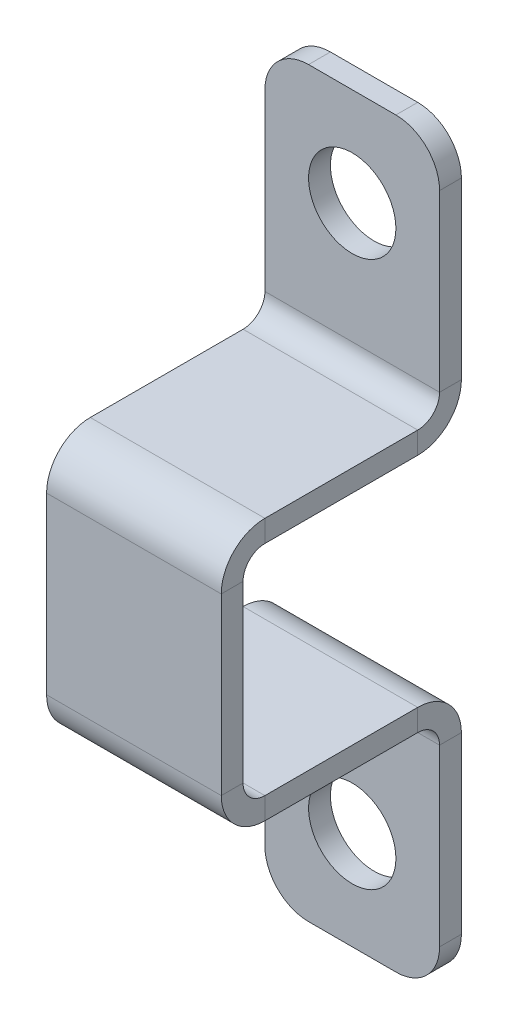
ISO-10303-21;
HEADER;
FILE_DESCRIPTION(('STEP AP214'),'2;1');
FILE_NAME('part.step','',(''),(''),'','','');
FILE_SCHEMA(('AUTOMOTIVE_DESIGN { 1 0 10303 214 1 1 1 1 }'));
ENDSEC;
DATA;
#1=APPLICATION_CONTEXT('core data for automotive mechanical design processes');
#2=APPLICATION_PROTOCOL_DEFINITION('international standard','automotive_design',2000,#1);
#3=PRODUCT_CONTEXT('',#1,'mechanical');
#4=PRODUCT('Part','Part','',(#3));
#5=PRODUCT_RELATED_PRODUCT_CATEGORY('part','',(#4));
#6=PRODUCT_DEFINITION_FORMATION('','',#4);
#7=PRODUCT_DEFINITION_CONTEXT('part definition',#1,'design');
#8=PRODUCT_DEFINITION('design','',#6,#7);
#9=PRODUCT_DEFINITION_SHAPE('','',#8);
#10=(LENGTH_UNIT() NAMED_UNIT(*) SI_UNIT(.MILLI.,.METRE.));
#11=(NAMED_UNIT(*) PLANE_ANGLE_UNIT() SI_UNIT($,.RADIAN.));
#12=(NAMED_UNIT(*) SI_UNIT($,.STERADIAN.) SOLID_ANGLE_UNIT());
#13=UNCERTAINTY_MEASURE_WITH_UNIT(LENGTH_MEASURE(1.E-05),#10,'distance_accuracy_value','');
#14=(GEOMETRIC_REPRESENTATION_CONTEXT(3) GLOBAL_UNCERTAINTY_ASSIGNED_CONTEXT((#13)) GLOBAL_UNIT_ASSIGNED_CONTEXT((#10,
#11,#12)) REPRESENTATION_CONTEXT('',''));
#15=CARTESIAN_POINT('',(0.,0.,0.));
#16=DIRECTION('',(0.,0.,1.));
#17=DIRECTION('',(1.,0.,0.));
#18=AXIS2_PLACEMENT_3D('',#15,#16,#17);
#19=CARTESIAN_POINT('',(58.047155018307,6.,14.0000000000001));
#20=DIRECTION('',(-1.,0.,0.));
#21=DIRECTION('',(0.,0.,1.));
#22=AXIS2_PLACEMENT_3D('',#19,#20,#21);
#23=PLANE('',#22);
#24=DIRECTION('',(0.,0.,-1.));
#25=VECTOR('',#24,1.);
#26=CARTESIAN_POINT('',(58.047155018307,6.,14.0000000000001));
#27=LINE('',#26,#25);
#28=CARTESIAN_POINT('',(58.047155018307,6.,13.0000000000001));
#29=VERTEX_POINT('',#28);
#30=CARTESIAN_POINT('',(58.047155018307,6.00000000000002,6.00000000000005));
#31=VERTEX_POINT('',#30);
#32=EDGE_CURVE('E314',#29,#31,#27,.T.);
#33=ORIENTED_EDGE('',*,*,#32,.T.);
#34=DIRECTION('',(0.,-1.,0.));
#35=VECTOR('',#34,1.);
#36=CARTESIAN_POINT('',(58.047155018307,6.00000000000002,6.00000000000005));
#37=LINE('',#36,#35);
#38=CARTESIAN_POINT('',(58.047155018307,5.00000000000002,6.00000000000005));
#39=VERTEX_POINT('',#38);
#40=EDGE_CURVE('E242',#31,#39,#37,.T.);
#41=ORIENTED_EDGE('',*,*,#40,.T.);
#42=DIRECTION('',(0.,0.,-1.));
#43=VECTOR('',#42,1.);
#44=CARTESIAN_POINT('',(58.047155018307,5.,14.0000000000001));
#45=LINE('',#44,#43);
#46=CARTESIAN_POINT('',(58.047155018307,5.,13.0000000000001));
#47=VERTEX_POINT('',#46);
#48=EDGE_CURVE('E313',#47,#39,#45,.T.);
#49=ORIENTED_EDGE('',*,*,#48,.F.);
#50=DIRECTION('',(0.,1.,0.));
#51=VECTOR('',#50,1.);
#52=CARTESIAN_POINT('',(58.047155018307,5.,13.0000000000001));
#53=LINE('',#52,#51);
#54=EDGE_CURVE('E301',#47,#29,#53,.T.);
#55=ORIENTED_EDGE('',*,*,#54,.T.);
#56=EDGE_LOOP('',(#33,#41,#49,#55));
#57=FACE_BOUND('',#56,.T.);
#58=ADVANCED_FACE('F36',(#57),#23,.T.);
#59=CARTESIAN_POINT('',(0.,6.00000000000005,0.));
#60=DIRECTION('',(0.,-1.,0.));
#61=DIRECTION('',(0.,0.,-1.));
#62=AXIS2_PLACEMENT_3D('',#59,#60,#61);
#63=PLANE('',#62);
#64=DIRECTION('',(-1.,0.,0.));
#65=VECTOR('',#64,1.);
#66=CARTESIAN_POINT('',(58.047155018307,6.00000000000002,6.00000000000005));
#67=LINE('',#66,#65);
#68=CARTESIAN_POINT('',(66.047155018307,6.00000000000002,6.00000000000005));
#69=VERTEX_POINT('',#68);
#70=EDGE_CURVE('E246',#31,#69,#67,.F.);
#71=ORIENTED_EDGE('',*,*,#70,.F.);
#72=ORIENTED_EDGE('',*,*,#32,.F.);
#73=DIRECTION('',(-1.,0.,0.));
#74=VECTOR('',#73,1.);
#75=CARTESIAN_POINT('',(0.,6.,13.0000000000001));
#76=LINE('',#75,#74);
#77=CARTESIAN_POINT('',(66.047155018307,6.,13.0000000000001));
#78=VERTEX_POINT('',#77);
#79=EDGE_CURVE('E309',#78,#29,#76,.T.);
#80=ORIENTED_EDGE('',*,*,#79,.F.);
#81=DIRECTION('',(0.,0.,1.));
#82=VECTOR('',#81,1.);
#83=CARTESIAN_POINT('',(66.047155018307,6.00000000000003,5.00000000000005));
#84=LINE('',#83,#82);
#85=EDGE_CURVE('E317',#69,#78,#84,.T.);
#86=ORIENTED_EDGE('',*,*,#85,.F.);
#87=EDGE_LOOP('',(#71,#72,#80,#86));
#88=FACE_BOUND('',#87,.T.);
#89=ADVANCED_FACE('F480',(#88),#63,.F.);
#90=CARTESIAN_POINT('',(0.,5.00000000000005,0.));
#91=DIRECTION('',(0.,-1.,0.));
#92=DIRECTION('',(0.,0.,-1.));
#93=AXIS2_PLACEMENT_3D('',#90,#91,#92);
#94=PLANE('',#93);
#95=ORIENTED_EDGE('',*,*,#48,.T.);
#96=DIRECTION('',(-1.,0.,0.));
#97=VECTOR('',#96,1.);
#98=CARTESIAN_POINT('',(58.047155018307,5.00000000000002,6.00000000000005));
#99=LINE('',#98,#97);
#100=CARTESIAN_POINT('',(66.047155018307,5.00000000000003,6.00000000000005));
#101=VERTEX_POINT('',#100);
#102=EDGE_CURVE('E206',#39,#101,#99,.F.);
#103=ORIENTED_EDGE('',*,*,#102,.T.);
#104=DIRECTION('',(0.,0.,1.));
#105=VECTOR('',#104,1.);
#106=CARTESIAN_POINT('',(66.047155018307,5.00000000000003,5.00000000000005));
#107=LINE('',#106,#105);
#108=CARTESIAN_POINT('',(66.047155018307,5.,13.0000000000001));
#109=VERTEX_POINT('',#108);
#110=EDGE_CURVE('E318',#101,#109,#107,.T.);
#111=ORIENTED_EDGE('',*,*,#110,.T.);
#112=DIRECTION('',(1.,0.,0.));
#113=VECTOR('',#112,1.);
#114=CARTESIAN_POINT('',(58.047155018307,5.,13.0000000000001));
#115=LINE('',#114,#113);
#116=EDGE_CURVE('E303',#47,#109,#115,.T.);
#117=ORIENTED_EDGE('',*,*,#116,.F.);
#118=EDGE_LOOP('',(#95,#103,#111,#117));
#119=FACE_BOUND('',#118,.T.);
#120=ADVANCED_FACE('F486',(#119),#94,.T.);
#121=CARTESIAN_POINT('',(66.047155018307,-6.00000000000003,5.00000000000005));
#122=DIRECTION('',(1.,0.,0.));
#123=DIRECTION('',(0.,0.,-1.));
#124=AXIS2_PLACEMENT_3D('',#121,#122,#123);
#125=PLANE('',#124);
#126=DIRECTION('',(0.,0.,-1.));
#127=VECTOR('',#126,1.);
#128=CARTESIAN_POINT('',(66.047155018307,-6.00000000000003,5.00000000000005));
#129=LINE('',#128,#127);
#130=CARTESIAN_POINT('',(66.047155018307,-6.,13.0000000000001));
#131=VERTEX_POINT('',#130);
#132=CARTESIAN_POINT('',(66.047155018307,-6.00000000000003,6.00000000000005));
#133=VERTEX_POINT('',#132);
#134=EDGE_CURVE('E359',#131,#133,#129,.T.);
#135=ORIENTED_EDGE('',*,*,#134,.T.);
#136=DIRECTION('',(0.,1.,0.));
#137=VECTOR('',#136,1.);
#138=CARTESIAN_POINT('',(66.047155018307,-6.00000000000003,6.00000000000005));
#139=LINE('',#138,#137);
#140=CARTESIAN_POINT('',(66.047155018307,-5.00000000000003,6.00000000000005));
#141=VERTEX_POINT('',#140);
#142=EDGE_CURVE('E287',#133,#141,#139,.T.);
#143=ORIENTED_EDGE('',*,*,#142,.T.);
#144=DIRECTION('',(0.,0.,-1.));
#145=VECTOR('',#144,1.);
#146=CARTESIAN_POINT('',(66.047155018307,-5.00000000000003,5.00000000000005));
#147=LINE('',#146,#145);
#148=CARTESIAN_POINT('',(66.047155018307,-5.,13.0000000000001));
#149=VERTEX_POINT('',#148);
#150=EDGE_CURVE('E358',#149,#141,#147,.T.);
#151=ORIENTED_EDGE('',*,*,#150,.F.);
#152=DIRECTION('',(0.,-1.,0.));
#153=VECTOR('',#152,1.);
#154=CARTESIAN_POINT('',(66.047155018307,-5.,13.0000000000001));
#155=LINE('',#154,#153);
#156=EDGE_CURVE('E344',#149,#131,#155,.T.);
#157=ORIENTED_EDGE('',*,*,#156,.T.);
#158=EDGE_LOOP('',(#135,#143,#151,#157));
#159=FACE_BOUND('',#158,.T.);
#160=ADVANCED_FACE('F514',(#159),#125,.T.);
#161=CARTESIAN_POINT('',(0.,-6.00000000000005,0.));
#162=DIRECTION('',(0.,-1.,0.));
#163=DIRECTION('',(0.,0.,-1.));
#164=AXIS2_PLACEMENT_3D('',#161,#162,#163);
#165=PLANE('',#164);
#166=DIRECTION('',(0.,0.,1.));
#167=VECTOR('',#166,1.);
#168=CARTESIAN_POINT('',(58.047155018307,-6.,14.0000000000001));
#169=LINE('',#168,#167);
#170=CARTESIAN_POINT('',(58.047155018307,-6.00000000000003,6.00000000000005));
#171=VERTEX_POINT('',#170);
#172=CARTESIAN_POINT('',(58.047155018307,-6.,13.0000000000001));
#173=VERTEX_POINT('',#172);
#174=EDGE_CURVE('E362',#171,#173,#169,.T.);
#175=ORIENTED_EDGE('',*,*,#174,.F.);
#176=DIRECTION('',(1.,0.,0.));
#177=VECTOR('',#176,1.);
#178=CARTESIAN_POINT('',(66.047155018307,-6.00000000000003,6.00000000000005));
#179=LINE('',#178,#177);
#180=EDGE_CURVE('E293',#133,#171,#179,.F.);
#181=ORIENTED_EDGE('',*,*,#180,.F.);
#182=ORIENTED_EDGE('',*,*,#134,.F.);
#183=DIRECTION('',(-1.,0.,0.));
#184=VECTOR('',#183,1.);
#185=CARTESIAN_POINT('',(0.,-6.,13.0000000000001));
#186=LINE('',#185,#184);
#187=EDGE_CURVE('E353',#131,#173,#186,.T.);
#188=ORIENTED_EDGE('',*,*,#187,.T.);
#189=EDGE_LOOP('',(#175,#181,#182,#188));
#190=FACE_BOUND('',#189,.T.);
#191=ADVANCED_FACE('F510',(#190),#165,.T.);
#192=CARTESIAN_POINT('',(0.,-5.00000000000005,0.));
#193=DIRECTION('',(0.,-1.,0.));
#194=DIRECTION('',(0.,0.,-1.));
#195=AXIS2_PLACEMENT_3D('',#192,#193,#194);
#196=PLANE('',#195);
#197=DIRECTION('',(1.,0.,0.));
#198=VECTOR('',#197,1.);
#199=CARTESIAN_POINT('',(66.047155018307,-5.00000000000003,6.00000000000005));
#200=LINE('',#199,#198);
#201=CARTESIAN_POINT('',(58.047155018307,-5.00000000000003,6.00000000000005));
#202=VERTEX_POINT('',#201);
#203=EDGE_CURVE('E281',#141,#202,#200,.F.);
#204=ORIENTED_EDGE('',*,*,#203,.T.);
#205=DIRECTION('',(0.,0.,1.));
#206=VECTOR('',#205,1.);
#207=CARTESIAN_POINT('',(58.047155018307,-5.,14.0000000000001));
#208=LINE('',#207,#206);
#209=CARTESIAN_POINT('',(58.047155018307,-5.,13.0000000000001));
#210=VERTEX_POINT('',#209);
#211=EDGE_CURVE('E363',#202,#210,#208,.T.);
#212=ORIENTED_EDGE('',*,*,#211,.T.);
#213=DIRECTION('',(-1.,0.,0.));
#214=VECTOR('',#213,1.);
#215=CARTESIAN_POINT('',(66.047155018307,-5.,13.0000000000001));
#216=LINE('',#215,#214);
#217=EDGE_CURVE('E347',#149,#210,#216,.T.);
#218=ORIENTED_EDGE('',*,*,#217,.F.);
#219=ORIENTED_EDGE('',*,*,#150,.T.);
#220=EDGE_LOOP('',(#204,#212,#218,#219));
#221=FACE_BOUND('',#220,.T.);
#222=ADVANCED_FACE('F513',(#221),#196,.F.);
#223=CARTESIAN_POINT('',(0.,0.,14.0000000000001));
#224=DIRECTION('',(0.,0.,1.));
#225=DIRECTION('',(1.,0.,0.));
#226=AXIS2_PLACEMENT_3D('',#223,#224,#225);
#227=PLANE('',#226);
#228=DIRECTION('',(1.,0.,0.));
#229=VECTOR('',#228,1.);
#230=CARTESIAN_POINT('',(66.047155018307,4.,14.0000000000001));
#231=LINE('',#230,#229);
#232=CARTESIAN_POINT('',(66.047155018307,4.,14.0000000000001));
#233=VERTEX_POINT('',#232);
#234=CARTESIAN_POINT('',(58.047155018307,4.,14.0000000000001));
#235=VERTEX_POINT('',#234);
#236=EDGE_CURVE('E337',#233,#235,#231,.F.);
#237=ORIENTED_EDGE('',*,*,#236,.F.);
#238=DIRECTION('',(0.,1.,0.));
#239=VECTOR('',#238,1.);
#240=CARTESIAN_POINT('',(66.047155018307,5.,14.0000000000001));
#241=LINE('',#240,#239);
#242=CARTESIAN_POINT('',(66.047155018307,-4.,14.0000000000001));
#243=VERTEX_POINT('',#242);
#244=EDGE_CURVE('E392',#243,#233,#241,.T.);
#245=ORIENTED_EDGE('',*,*,#244,.F.);
#246=DIRECTION('',(-1.,0.,0.));
#247=VECTOR('',#246,1.);
#248=CARTESIAN_POINT('',(58.047155018307,-4.,14.0000000000001));
#249=LINE('',#248,#247);
#250=CARTESIAN_POINT('',(58.047155018307,-4.,14.0000000000001));
#251=VERTEX_POINT('',#250);
#252=EDGE_CURVE('E382',#251,#243,#249,.F.);
#253=ORIENTED_EDGE('',*,*,#252,.F.);
#254=DIRECTION('',(0.,-1.,0.));
#255=VECTOR('',#254,1.);
#256=CARTESIAN_POINT('',(58.047155018307,5.,14.0000000000001));
#257=LINE('',#256,#255);
#258=EDGE_CURVE('E395',#235,#251,#257,.T.);
#259=ORIENTED_EDGE('',*,*,#258,.F.);
#260=EDGE_LOOP('',(#237,#245,#253,#259));
#261=FACE_BOUND('',#260,.T.);
#262=ADVANCED_FACE('F518',(#261),#227,.F.);
#263=CARTESIAN_POINT('',(0.,0.,15.0000000000001));
#264=DIRECTION('',(0.,0.,1.));
#265=DIRECTION('',(1.,0.,0.));
#266=AXIS2_PLACEMENT_3D('',#263,#264,#265);
#267=PLANE('',#266);
#268=DIRECTION('',(0.,1.,0.));
#269=VECTOR('',#268,1.);
#270=CARTESIAN_POINT('',(66.047155018307,5.,15.0000000000001));
#271=LINE('',#270,#269);
#272=CARTESIAN_POINT('',(66.047155018307,-4.,15.0000000000001));
#273=VERTEX_POINT('',#272);
#274=CARTESIAN_POINT('',(66.047155018307,4.,15.0000000000001));
#275=VERTEX_POINT('',#274);
#276=EDGE_CURVE('E389',#273,#275,#271,.T.);
#277=ORIENTED_EDGE('',*,*,#276,.T.);
#278=DIRECTION('',(1.,0.,0.));
#279=VECTOR('',#278,1.);
#280=CARTESIAN_POINT('',(66.047155018307,4.,15.0000000000001));
#281=LINE('',#280,#279);
#282=CARTESIAN_POINT('',(58.047155018307,4.,15.0000000000001));
#283=VERTEX_POINT('',#282);
#284=EDGE_CURVE('E324',#275,#283,#281,.F.);
#285=ORIENTED_EDGE('',*,*,#284,.T.);
#286=DIRECTION('',(0.,-1.,0.));
#287=VECTOR('',#286,1.);
#288=CARTESIAN_POINT('',(58.047155018307,5.,15.0000000000001));
#289=LINE('',#288,#287);
#290=CARTESIAN_POINT('',(58.047155018307,-4.,15.0000000000001));
#291=VERTEX_POINT('',#290);
#292=EDGE_CURVE('E396',#283,#291,#289,.T.);
#293=ORIENTED_EDGE('',*,*,#292,.T.);
#294=DIRECTION('',(-1.,0.,0.));
#295=VECTOR('',#294,1.);
#296=CARTESIAN_POINT('',(58.047155018307,-4.,15.0000000000001));
#297=LINE('',#296,#295);
#298=EDGE_CURVE('E369',#291,#273,#297,.F.);
#299=ORIENTED_EDGE('',*,*,#298,.T.);
#300=EDGE_LOOP('',(#277,#285,#293,#299));
#301=FACE_BOUND('',#300,.T.);
#302=ADVANCED_FACE('F545',(#301),#267,.T.);
#303=CARTESIAN_POINT('',(66.047155018307,5.,14.0000000000001));
#304=DIRECTION('',(1.,0.,0.));
#305=DIRECTION('',(0.,0.,-1.));
#306=AXIS2_PLACEMENT_3D('',#303,#304,#305);
#307=PLANE('',#306);
#308=ORIENTED_EDGE('',*,*,#244,.T.);
#309=DIRECTION('',(0.,0.,1.));
#310=VECTOR('',#309,1.);
#311=CARTESIAN_POINT('',(66.047155018307,4.,14.0000000000001));
#312=LINE('',#311,#310);
#313=EDGE_CURVE('E331',#233,#275,#312,.T.);
#314=ORIENTED_EDGE('',*,*,#313,.T.);
#315=ORIENTED_EDGE('',*,*,#276,.F.);
#316=DIRECTION('',(0.,0.,1.));
#317=VECTOR('',#316,1.);
#318=CARTESIAN_POINT('',(66.047155018307,-4.,14.0000000000001));
#319=LINE('',#318,#317);
#320=EDGE_CURVE('E386',#243,#273,#319,.T.);
#321=ORIENTED_EDGE('',*,*,#320,.F.);
#322=EDGE_LOOP('',(#308,#314,#315,#321));
#323=FACE_BOUND('',#322,.T.);
#324=ADVANCED_FACE('F549',(#323),#307,.T.);
#325=CARTESIAN_POINT('',(58.047155018307,5.,14.0000000000001));
#326=DIRECTION('',(-1.,0.,0.));
#327=DIRECTION('',(0.,0.,1.));
#328=AXIS2_PLACEMENT_3D('',#325,#326,#327);
#329=PLANE('',#328);
#330=DIRECTION('',(0.,0.,1.));
#331=VECTOR('',#330,1.);
#332=CARTESIAN_POINT('',(58.047155018307,4.,14.0000000000001));
#333=LINE('',#332,#331);
#334=EDGE_CURVE('E341',#235,#283,#333,.T.);
#335=ORIENTED_EDGE('',*,*,#334,.F.);
#336=ORIENTED_EDGE('',*,*,#258,.T.);
#337=DIRECTION('',(0.,0.,1.));
#338=VECTOR('',#337,1.);
#339=CARTESIAN_POINT('',(58.047155018307,-4.,14.0000000000001));
#340=LINE('',#339,#338);
#341=EDGE_CURVE('E376',#251,#291,#340,.T.);
#342=ORIENTED_EDGE('',*,*,#341,.T.);
#343=ORIENTED_EDGE('',*,*,#292,.F.);
#344=EDGE_LOOP('',(#335,#336,#342,#343));
#345=FACE_BOUND('',#344,.T.);
#346=ADVANCED_FACE('F538',(#345),#329,.T.);
#347=CARTESIAN_POINT('',(66.047155018307,-4.,13.0000000000001));
#348=DIRECTION('',(1.,0.,0.));
#349=DIRECTION('',(0.,0.,-1.));
#350=AXIS2_PLACEMENT_3D('',#347,#348,#349);
#351=PLANE('',#350);
#352=ORIENTED_EDGE('',*,*,#156,.F.);
#353=CARTESIAN_POINT('',(66.047155018307,-4.,13.0000000000001));
#354=DIRECTION('',(-1.,0.,0.));
#355=DIRECTION('',(0.,0.,1.));
#356=AXIS2_PLACEMENT_3D('',#353,#354,#355);
#357=CIRCLE('',#356,1.);
#358=EDGE_CURVE('E379',#243,#149,#357,.F.);
#359=ORIENTED_EDGE('',*,*,#358,.F.);
#360=ORIENTED_EDGE('',*,*,#320,.T.);
#361=CARTESIAN_POINT('',(66.047155018307,-4.,13.0000000000001));
#362=DIRECTION('',(-1.,0.,0.));
#363=DIRECTION('',(0.,0.,1.));
#364=AXIS2_PLACEMENT_3D('',#361,#362,#363);
#365=CIRCLE('',#364,2.);
#366=EDGE_CURVE('E372',#273,#131,#365,.F.);
#367=ORIENTED_EDGE('',*,*,#366,.T.);
#368=EDGE_LOOP('',(#352,#359,#360,#367));
#369=FACE_BOUND('',#368,.T.);
#370=ADVANCED_FACE('F535',(#369),#351,.T.);
#371=CARTESIAN_POINT('',(58.047155018307,-4.,13.0000000000001));
#372=DIRECTION('',(1.,0.,0.));
#373=DIRECTION('',(0.,0.,-1.));
#374=AXIS2_PLACEMENT_3D('',#371,#372,#373);
#375=PLANE('',#374);
#376=CARTESIAN_POINT('',(58.047155018307,-4.,13.0000000000001));
#377=DIRECTION('',(-1.,0.,0.));
#378=DIRECTION('',(0.,0.,1.));
#379=AXIS2_PLACEMENT_3D('',#376,#377,#378);
#380=CIRCLE('',#379,1.);
#381=EDGE_CURVE('E365',#210,#251,#380,.T.);
#382=ORIENTED_EDGE('',*,*,#381,.F.);
#383=DIRECTION('',(0.,-1.,0.));
#384=VECTOR('',#383,1.);
#385=CARTESIAN_POINT('',(58.047155018307,-5.,13.0000000000001));
#386=LINE('',#385,#384);
#387=EDGE_CURVE('E350',#210,#173,#386,.T.);
#388=ORIENTED_EDGE('',*,*,#387,.T.);
#389=CARTESIAN_POINT('',(58.047155018307,-4.,13.0000000000001));
#390=DIRECTION('',(-1.,0.,0.));
#391=DIRECTION('',(0.,0.,1.));
#392=AXIS2_PLACEMENT_3D('',#389,#390,#391);
#393=CIRCLE('',#392,2.);
#394=EDGE_CURVE('E373',#173,#291,#393,.T.);
#395=ORIENTED_EDGE('',*,*,#394,.T.);
#396=ORIENTED_EDGE('',*,*,#341,.F.);
#397=EDGE_LOOP('',(#382,#388,#395,#396));
#398=FACE_BOUND('',#397,.T.);
#399=ADVANCED_FACE('F530',(#398),#375,.F.);
#400=CARTESIAN_POINT('',(58.047155018307,-4.,13.0000000000001));
#401=DIRECTION('',(-1.,0.,0.));
#402=DIRECTION('',(0.,-1.,0.));
#403=AXIS2_PLACEMENT_3D('',#400,#401,#402);
#404=CYLINDRICAL_SURFACE('',#403,2.);
#405=ORIENTED_EDGE('',*,*,#298,.F.);
#406=ORIENTED_EDGE('',*,*,#394,.F.);
#407=ORIENTED_EDGE('',*,*,#187,.F.);
#408=ORIENTED_EDGE('',*,*,#366,.F.);
#409=EDGE_LOOP('',(#405,#406,#407,#408));
#410=FACE_BOUND('',#409,.T.);
#411=ADVANCED_FACE('F527',(#410),#404,.T.);
#412=CARTESIAN_POINT('',(58.047155018307,-4.,13.0000000000001));
#413=DIRECTION('',(-1.,0.,0.));
#414=DIRECTION('',(0.,-1.,0.));
#415=AXIS2_PLACEMENT_3D('',#412,#413,#414);
#416=CYLINDRICAL_SURFACE('',#415,1.);
#417=ORIENTED_EDGE('',*,*,#252,.T.);
#418=ORIENTED_EDGE('',*,*,#358,.T.);
#419=ORIENTED_EDGE('',*,*,#217,.T.);
#420=ORIENTED_EDGE('',*,*,#381,.T.);
#421=EDGE_LOOP('',(#417,#418,#419,#420));
#422=FACE_BOUND('',#421,.T.);
#423=ADVANCED_FACE('F522',(#422),#416,.F.);
#424=CARTESIAN_POINT('',(58.047155018307,-6.,14.0000000000001));
#425=DIRECTION('',(-1.,0.,0.));
#426=DIRECTION('',(0.,0.,1.));
#427=AXIS2_PLACEMENT_3D('',#424,#425,#426);
#428=PLANE('',#427);
#429=DIRECTION('',(0.,1.,0.));
#430=VECTOR('',#429,1.);
#431=CARTESIAN_POINT('',(58.047155018307,-6.00000000000003,6.00000000000005));
#432=LINE('',#431,#430);
#433=EDGE_CURVE('E298',#171,#202,#432,.T.);
#434=ORIENTED_EDGE('',*,*,#433,.F.);
#435=ORIENTED_EDGE('',*,*,#174,.T.);
#436=ORIENTED_EDGE('',*,*,#387,.F.);
#437=ORIENTED_EDGE('',*,*,#211,.F.);
#438=EDGE_LOOP('',(#434,#435,#436,#437));
#439=FACE_BOUND('',#438,.T.);
#440=ADVANCED_FACE('F505',(#439),#428,.T.);
#441=CARTESIAN_POINT('',(58.047155018307,4.,13.0000000000001));
#442=DIRECTION('',(-1.,0.,0.));
#443=DIRECTION('',(0.,0.,1.));
#444=AXIS2_PLACEMENT_3D('',#441,#442,#443);
#445=PLANE('',#444);
#446=ORIENTED_EDGE('',*,*,#54,.F.);
#447=CARTESIAN_POINT('',(58.047155018307,4.,13.0000000000001));
#448=DIRECTION('',(1.,0.,0.));
#449=DIRECTION('',(0.,0.,-1.));
#450=AXIS2_PLACEMENT_3D('',#447,#448,#449);
#451=CIRCLE('',#450,1.);
#452=EDGE_CURVE('E334',#235,#47,#451,.F.);
#453=ORIENTED_EDGE('',*,*,#452,.F.);
#454=ORIENTED_EDGE('',*,*,#334,.T.);
#455=CARTESIAN_POINT('',(58.047155018307,4.,13.0000000000001));
#456=DIRECTION('',(1.,0.,0.));
#457=DIRECTION('',(0.,0.,-1.));
#458=AXIS2_PLACEMENT_3D('',#455,#456,#457);
#459=CIRCLE('',#458,2.);
#460=EDGE_CURVE('E327',#283,#29,#459,.F.);
#461=ORIENTED_EDGE('',*,*,#460,.T.);
#462=EDGE_LOOP('',(#446,#453,#454,#461));
#463=FACE_BOUND('',#462,.T.);
#464=ADVANCED_FACE('F502',(#463),#445,.T.);
#465=CARTESIAN_POINT('',(66.047155018307,4.,13.0000000000001));
#466=DIRECTION('',(-1.,0.,0.));
#467=DIRECTION('',(0.,0.,1.));
#468=AXIS2_PLACEMENT_3D('',#465,#466,#467);
#469=PLANE('',#468);
#470=CARTESIAN_POINT('',(66.047155018307,4.,13.0000000000001));
#471=DIRECTION('',(1.,0.,0.));
#472=DIRECTION('',(0.,0.,-1.));
#473=AXIS2_PLACEMENT_3D('',#470,#471,#472);
#474=CIRCLE('',#473,1.);
#475=EDGE_CURVE('E320',#109,#233,#474,.T.);
#476=ORIENTED_EDGE('',*,*,#475,.F.);
#477=DIRECTION('',(0.,1.,0.));
#478=VECTOR('',#477,1.);
#479=CARTESIAN_POINT('',(66.047155018307,5.,13.0000000000001));
#480=LINE('',#479,#478);
#481=EDGE_CURVE('E306',#109,#78,#480,.T.);
#482=ORIENTED_EDGE('',*,*,#481,.T.);
#483=CARTESIAN_POINT('',(66.047155018307,4.,13.0000000000001));
#484=DIRECTION('',(1.,0.,0.));
#485=DIRECTION('',(0.,0.,-1.));
#486=AXIS2_PLACEMENT_3D('',#483,#484,#485);
#487=CIRCLE('',#486,2.);
#488=EDGE_CURVE('E328',#78,#275,#487,.T.);
#489=ORIENTED_EDGE('',*,*,#488,.T.);
#490=ORIENTED_EDGE('',*,*,#313,.F.);
#491=EDGE_LOOP('',(#476,#482,#489,#490));
#492=FACE_BOUND('',#491,.T.);
#493=ADVANCED_FACE('F497',(#492),#469,.F.);
#494=CARTESIAN_POINT('',(66.047155018307,4.,13.0000000000001));
#495=DIRECTION('',(1.,0.,0.));
#496=DIRECTION('',(0.,1.,0.));
#497=AXIS2_PLACEMENT_3D('',#494,#495,#496);
#498=CYLINDRICAL_SURFACE('',#497,2.);
#499=ORIENTED_EDGE('',*,*,#284,.F.);
#500=ORIENTED_EDGE('',*,*,#488,.F.);
#501=ORIENTED_EDGE('',*,*,#79,.T.);
#502=ORIENTED_EDGE('',*,*,#460,.F.);
#503=EDGE_LOOP('',(#499,#500,#501,#502));
#504=FACE_BOUND('',#503,.T.);
#505=ADVANCED_FACE('F493',(#504),#498,.T.);
#506=CARTESIAN_POINT('',(66.047155018307,4.,13.0000000000001));
#507=DIRECTION('',(1.,0.,0.));
#508=DIRECTION('',(0.,1.,0.));
#509=AXIS2_PLACEMENT_3D('',#506,#507,#508);
#510=CYLINDRICAL_SURFACE('',#509,1.);
#511=ORIENTED_EDGE('',*,*,#236,.T.);
#512=ORIENTED_EDGE('',*,*,#452,.T.);
#513=ORIENTED_EDGE('',*,*,#116,.T.);
#514=ORIENTED_EDGE('',*,*,#475,.T.);
#515=EDGE_LOOP('',(#511,#512,#513,#514));
#516=FACE_BOUND('',#515,.T.);
#517=ADVANCED_FACE('F496',(#516),#510,.F.);
#518=CARTESIAN_POINT('',(66.047155018307,6.00000000000003,5.00000000000005));
#519=DIRECTION('',(1.,0.,0.));
#520=DIRECTION('',(0.,0.,-1.));
#521=AXIS2_PLACEMENT_3D('',#518,#519,#520);
#522=PLANE('',#521);
#523=DIRECTION('',(0.,-1.,0.));
#524=VECTOR('',#523,1.);
#525=CARTESIAN_POINT('',(66.047155018307,6.00000000000002,6.00000000000005));
#526=LINE('',#525,#524);
#527=EDGE_CURVE('E249',#69,#101,#526,.T.);
#528=ORIENTED_EDGE('',*,*,#527,.F.);
#529=ORIENTED_EDGE('',*,*,#85,.T.);
#530=ORIENTED_EDGE('',*,*,#481,.F.);
#531=ORIENTED_EDGE('',*,*,#110,.F.);
#532=EDGE_LOOP('',(#528,#529,#530,#531));
#533=FACE_BOUND('',#532,.T.);
#534=ADVANCED_FACE('F491',(#533),#522,.T.);
#535=CARTESIAN_POINT('',(58.047155018307,-7.00000000000003,6.00000000000005));
#536=DIRECTION('',(-1.,0.,0.));
#537=DIRECTION('',(0.,0.,1.));
#538=AXIS2_PLACEMENT_3D('',#535,#536,#537);
#539=PLANE('',#538);
#540=DIRECTION('',(0.,0.,-1.));
#541=VECTOR('',#540,1.);
#542=CARTESIAN_POINT('',(58.047155018307,-7.00000000000003,5.00000000000005));
#543=LINE('',#542,#541);
#544=CARTESIAN_POINT('',(58.047155018307,-7.00000000000003,5.00000000000005));
#545=VERTEX_POINT('',#544);
#546=CARTESIAN_POINT('',(58.047155018307,-7.00000000000003,4.00000000000005));
#547=VERTEX_POINT('',#546);
#548=EDGE_CURVE('E252',#545,#547,#543,.T.);
#549=ORIENTED_EDGE('',*,*,#548,.F.);
#550=CARTESIAN_POINT('',(58.047155018307,-7.00000000000003,6.00000000000005));
#551=DIRECTION('',(1.,0.,0.));
#552=DIRECTION('',(0.,0.,-1.));
#553=AXIS2_PLACEMENT_3D('',#550,#551,#552);
#554=CIRCLE('',#553,1.);
#555=EDGE_CURVE('E290',#171,#545,#554,.F.);
#556=ORIENTED_EDGE('',*,*,#555,.F.);
#557=ORIENTED_EDGE('',*,*,#433,.T.);
#558=CARTESIAN_POINT('',(58.047155018307,-7.00000000000003,6.00000000000005));
#559=DIRECTION('',(1.,0.,0.));
#560=DIRECTION('',(0.,0.,-1.));
#561=AXIS2_PLACEMENT_3D('',#558,#559,#560);
#562=CIRCLE('',#561,2.);
#563=EDGE_CURVE('E283',#202,#547,#562,.F.);
#564=ORIENTED_EDGE('',*,*,#563,.T.);
#565=EDGE_LOOP('',(#549,#556,#557,#564));
#566=FACE_BOUND('',#565,.T.);
#567=ADVANCED_FACE('F605',(#566),#539,.T.);
#568=CARTESIAN_POINT('',(66.047155018307,-7.00000000000003,6.00000000000005));
#569=DIRECTION('',(-1.,0.,0.));
#570=DIRECTION('',(0.,0.,1.));
#571=AXIS2_PLACEMENT_3D('',#568,#569,#570);
#572=PLANE('',#571);
#573=CARTESIAN_POINT('',(66.047155018307,-7.00000000000003,6.00000000000005));
#574=DIRECTION('',(1.,0.,0.));
#575=DIRECTION('',(0.,0.,-1.));
#576=AXIS2_PLACEMENT_3D('',#573,#574,#575);
#577=CIRCLE('',#576,1.);
#578=CARTESIAN_POINT('',(66.047155018307,-7.00000000000003,5.00000000000005));
#579=VERTEX_POINT('',#578);
#580=EDGE_CURVE('E274',#579,#133,#577,.T.);
#581=ORIENTED_EDGE('',*,*,#580,.F.);
#582=DIRECTION('',(0.,0.,-1.));
#583=VECTOR('',#582,1.);
#584=CARTESIAN_POINT('',(66.047155018307,-7.00000000000003,5.00000000000005));
#585=LINE('',#584,#583);
#586=CARTESIAN_POINT('',(66.047155018307,-7.00000000000002,4.00000000000005));
#587=VERTEX_POINT('',#586);
#588=EDGE_CURVE('E256',#579,#587,#585,.T.);
#589=ORIENTED_EDGE('',*,*,#588,.T.);
#590=CARTESIAN_POINT('',(66.047155018307,-7.00000000000003,6.00000000000005));
#591=DIRECTION('',(1.,0.,0.));
#592=DIRECTION('',(0.,0.,-1.));
#593=AXIS2_PLACEMENT_3D('',#590,#591,#592);
#594=CIRCLE('',#593,2.);
#595=EDGE_CURVE('E284',#587,#141,#594,.T.);
#596=ORIENTED_EDGE('',*,*,#595,.T.);
#597=ORIENTED_EDGE('',*,*,#142,.F.);
#598=EDGE_LOOP('',(#581,#589,#596,#597));
#599=FACE_BOUND('',#598,.T.);
#600=ADVANCED_FACE('F622',(#599),#572,.F.);
#601=CARTESIAN_POINT('',(66.047155018307,-7.00000000000003,6.00000000000005));
#602=DIRECTION('',(1.,0.,0.));
#603=DIRECTION('',(0.,0.,-1.));
#604=AXIS2_PLACEMENT_3D('',#601,#602,#603);
#605=CYLINDRICAL_SURFACE('',#604,2.);
#606=ORIENTED_EDGE('',*,*,#203,.F.);
#607=ORIENTED_EDGE('',*,*,#595,.F.);
#608=DIRECTION('',(-1.,0.,0.));
#609=VECTOR('',#608,1.);
#610=CARTESIAN_POINT('',(0.,-7.00000000000002,4.00000000000005));
#611=LINE('',#610,#609);
#612=EDGE_CURVE('E259',#587,#547,#611,.T.);
#613=ORIENTED_EDGE('',*,*,#612,.T.);
#614=ORIENTED_EDGE('',*,*,#563,.F.);
#615=EDGE_LOOP('',(#606,#607,#613,#614));
#616=FACE_BOUND('',#615,.T.);
#617=ADVANCED_FACE('F619',(#616),#605,.T.);
#618=CARTESIAN_POINT('',(66.047155018307,-7.00000000000003,6.00000000000005));
#619=DIRECTION('',(1.,0.,0.));
#620=DIRECTION('',(0.,0.,-1.));
#621=AXIS2_PLACEMENT_3D('',#618,#619,#620);
#622=CYLINDRICAL_SURFACE('',#621,1.);
#623=ORIENTED_EDGE('',*,*,#180,.T.);
#624=ORIENTED_EDGE('',*,*,#555,.T.);
#625=DIRECTION('',(1.,0.,0.));
#626=VECTOR('',#625,1.);
#627=CARTESIAN_POINT('',(58.047155018307,-7.00000000000003,5.00000000000005));
#628=LINE('',#627,#626);
#629=EDGE_CURVE('E254',#545,#579,#628,.T.);
#630=ORIENTED_EDGE('',*,*,#629,.T.);
#631=ORIENTED_EDGE('',*,*,#580,.T.);
#632=EDGE_LOOP('',(#623,#624,#630,#631));
#633=FACE_BOUND('',#632,.T.);
#634=ADVANCED_FACE('F609',(#633),#622,.F.);
#635=CARTESIAN_POINT('',(66.047155018307,-17.,4.00000000000005));
#636=DIRECTION('',(-1.,0.,0.));
#637=DIRECTION('',(0.,0.,1.));
#638=AXIS2_PLACEMENT_3D('',#635,#636,#637);
#639=PLANE('',#638);
#640=DIRECTION('',(0.,-1.,0.));
#641=VECTOR('',#640,1.);
#642=CARTESIAN_POINT('',(66.047155018307,-17.,5.00000000000005));
#643=LINE('',#642,#641);
#644=CARTESIAN_POINT('',(66.047155018307,-15.,5.00000000000005));
#645=VERTEX_POINT('',#644);
#646=EDGE_CURVE('E264',#579,#645,#643,.T.);
#647=ORIENTED_EDGE('',*,*,#646,.T.);
#648=DIRECTION('',(0.,0.,1.));
#649=VECTOR('',#648,1.);
#650=CARTESIAN_POINT('',(66.047155018307,-15.,4.00000000000005));
#651=LINE('',#650,#649);
#652=CARTESIAN_POINT('',(66.047155018307,-15.,4.00000000000005));
#653=VERTEX_POINT('',#652);
#654=EDGE_CURVE('E412',#645,#653,#651,.F.);
#655=ORIENTED_EDGE('',*,*,#654,.T.);
#656=DIRECTION('',(0.,-1.,0.));
#657=VECTOR('',#656,1.);
#658=CARTESIAN_POINT('',(66.047155018307,-17.,4.00000000000005));
#659=LINE('',#658,#657);
#660=EDGE_CURVE('E265',#587,#653,#659,.T.);
#661=ORIENTED_EDGE('',*,*,#660,.F.);
#662=ORIENTED_EDGE('',*,*,#588,.F.);
#663=EDGE_LOOP('',(#647,#655,#661,#662));
#664=FACE_BOUND('',#663,.T.);
#665=ADVANCED_FACE('F614',(#664),#639,.F.);
#666=CARTESIAN_POINT('',(58.047155018307,-6.00000000000003,4.00000000000005));
#667=DIRECTION('',(1.,0.,0.));
#668=DIRECTION('',(0.,0.,-1.));
#669=AXIS2_PLACEMENT_3D('',#666,#667,#668);
#670=PLANE('',#669);
#671=DIRECTION('',(0.,1.,0.));
#672=VECTOR('',#671,1.);
#673=CARTESIAN_POINT('',(58.047155018307,-6.00000000000003,4.00000000000005));
#674=LINE('',#673,#672);
#675=CARTESIAN_POINT('',(58.047155018307,-15.,4.00000000000005));
#676=VERTEX_POINT('',#675);
#677=EDGE_CURVE('E272',#676,#547,#674,.T.);
#678=ORIENTED_EDGE('',*,*,#677,.F.);
#679=DIRECTION('',(0.,0.,1.));
#680=VECTOR('',#679,1.);
#681=CARTESIAN_POINT('',(58.047155018307,-15.,4.00000000000005));
#682=LINE('',#681,#680);
#683=CARTESIAN_POINT('',(58.047155018307,-15.,5.00000000000005));
#684=VERTEX_POINT('',#683);
#685=EDGE_CURVE('E418',#676,#684,#682,.T.);
#686=ORIENTED_EDGE('',*,*,#685,.T.);
#687=DIRECTION('',(0.,1.,0.));
#688=VECTOR('',#687,1.);
#689=CARTESIAN_POINT('',(58.047155018307,-6.00000000000003,5.00000000000005));
#690=LINE('',#689,#688);
#691=EDGE_CURVE('E269',#684,#545,#690,.T.);
#692=ORIENTED_EDGE('',*,*,#691,.T.);
#693=ORIENTED_EDGE('',*,*,#548,.T.);
#694=EDGE_LOOP('',(#678,#686,#692,#693));
#695=FACE_BOUND('',#694,.T.);
#696=ADVANCED_FACE('F601',(#695),#670,.F.);
#697=CARTESIAN_POINT('',(0.,0.,4.00000000000005));
#698=DIRECTION('',(0.,0.,1.));
#699=DIRECTION('',(1.,0.,0.));
#700=AXIS2_PLACEMENT_3D('',#697,#698,#699);
#701=PLANE('',#700);
#702=CARTESIAN_POINT('',(62.047155018307,-12.4999999999999,4.00000000000005));
#703=DIRECTION('',(0.,0.,1.));
#704=DIRECTION('',(1.,0.,0.));
#705=AXIS2_PLACEMENT_3D('',#702,#703,#704);
#706=CIRCLE('',#705,2.);
#707=CARTESIAN_POINT('',(64.047155018307,-12.4999999999999,4.00000000000005));
#708=VERTEX_POINT('',#707);
#709=EDGE_CURVE('E452',#708,#708,#706,.T.);
#710=ORIENTED_EDGE('',*,*,#709,.T.);
#711=EDGE_LOOP('',(#710));
#712=FACE_BOUND('',#711,.T.);
#713=ORIENTED_EDGE('',*,*,#660,.T.);
#714=CARTESIAN_POINT('',(64.047155018307,-15.,4.00000000000005));
#715=DIRECTION('',(0.,0.,1.));
#716=DIRECTION('',(1.,0.,0.));
#717=AXIS2_PLACEMENT_3D('',#714,#715,#716);
#718=CIRCLE('',#717,2.);
#719=CARTESIAN_POINT('',(64.047155018307,-17.,4.00000000000005));
#720=VERTEX_POINT('',#719);
#721=EDGE_CURVE('E416',#653,#720,#718,.F.);
#722=ORIENTED_EDGE('',*,*,#721,.T.);
#723=DIRECTION('',(-1.,0.,0.));
#724=VECTOR('',#723,1.);
#725=CARTESIAN_POINT('',(58.047155018307,-17.,4.00000000000005));
#726=LINE('',#725,#724);
#727=CARTESIAN_POINT('',(60.047155018307,-17.,4.00000000000005));
#728=VERTEX_POINT('',#727);
#729=EDGE_CURVE('E268',#720,#728,#726,.T.);
#730=ORIENTED_EDGE('',*,*,#729,.T.);
#731=CARTESIAN_POINT('',(60.047155018307,-15.,4.00000000000005));
#732=DIRECTION('',(0.,0.,1.));
#733=DIRECTION('',(1.,0.,0.));
#734=AXIS2_PLACEMENT_3D('',#731,#732,#733);
#735=CIRCLE('',#734,2.);
#736=EDGE_CURVE('E414',#728,#676,#735,.F.);
#737=ORIENTED_EDGE('',*,*,#736,.T.);
#738=ORIENTED_EDGE('',*,*,#677,.T.);
#739=ORIENTED_EDGE('',*,*,#612,.F.);
#740=EDGE_LOOP('',(#713,#722,#730,#737,#738,#739));
#741=FACE_BOUND('',#740,.T.);
#742=ADVANCED_FACE('F586',(#712,#741),#701,.F.);
#743=CARTESIAN_POINT('',(0.,0.,5.00000000000005));
#744=DIRECTION('',(0.,0.,1.));
#745=DIRECTION('',(1.,0.,0.));
#746=AXIS2_PLACEMENT_3D('',#743,#744,#745);
#747=PLANE('',#746);
#748=CARTESIAN_POINT('',(62.047155018307,-12.4999999999999,5.00000000000005));
#749=DIRECTION('',(0.,0.,1.));
#750=DIRECTION('',(1.,0.,0.));
#751=AXIS2_PLACEMENT_3D('',#748,#749,#750);
#752=CIRCLE('',#751,2.);
#753=CARTESIAN_POINT('',(64.047155018307,-12.4999999999999,5.00000000000005));
#754=VERTEX_POINT('',#753);
#755=EDGE_CURVE('E456',#754,#754,#752,.T.);
#756=ORIENTED_EDGE('',*,*,#755,.F.);
#757=EDGE_LOOP('',(#756));
#758=FACE_BOUND('',#757,.T.);
#759=DIRECTION('',(-1.,0.,0.));
#760=VECTOR('',#759,1.);
#761=CARTESIAN_POINT('',(58.047155018307,-17.,5.00000000000005));
#762=LINE('',#761,#760);
#763=CARTESIAN_POINT('',(64.047155018307,-17.,5.00000000000005));
#764=VERTEX_POINT('',#763);
#765=CARTESIAN_POINT('',(60.047155018307,-17.,5.00000000000005));
#766=VERTEX_POINT('',#765);
#767=EDGE_CURVE('E277',#764,#766,#762,.T.);
#768=ORIENTED_EDGE('',*,*,#767,.F.);
#769=CARTESIAN_POINT('',(64.047155018307,-15.,5.00000000000005));
#770=DIRECTION('',(0.,0.,1.));
#771=DIRECTION('',(1.,0.,0.));
#772=AXIS2_PLACEMENT_3D('',#769,#770,#771);
#773=CIRCLE('',#772,2.);
#774=EDGE_CURVE('E410',#764,#645,#773,.T.);
#775=ORIENTED_EDGE('',*,*,#774,.T.);
#776=ORIENTED_EDGE('',*,*,#646,.F.);
#777=ORIENTED_EDGE('',*,*,#629,.F.);
#778=ORIENTED_EDGE('',*,*,#691,.F.);
#779=CARTESIAN_POINT('',(60.047155018307,-15.,5.00000000000005));
#780=DIRECTION('',(0.,0.,1.));
#781=DIRECTION('',(1.,0.,0.));
#782=AXIS2_PLACEMENT_3D('',#779,#780,#781);
#783=CIRCLE('',#782,2.);
#784=EDGE_CURVE('E408',#684,#766,#783,.T.);
#785=ORIENTED_EDGE('',*,*,#784,.T.);
#786=EDGE_LOOP('',(#768,#775,#776,#777,#778,#785));
#787=FACE_BOUND('',#786,.T.);
#788=ADVANCED_FACE('F582',(#758,#787),#747,.T.);
#789=CARTESIAN_POINT('',(58.047155018307,-17.,4.00000000000005));
#790=DIRECTION('',(0.,1.,0.));
#791=DIRECTION('',(0.,0.,1.));
#792=AXIS2_PLACEMENT_3D('',#789,#790,#791);
#793=PLANE('',#792);
#794=ORIENTED_EDGE('',*,*,#729,.F.);
#795=DIRECTION('',(0.,0.,1.));
#796=VECTOR('',#795,1.);
#797=CARTESIAN_POINT('',(64.047155018307,-17.,4.00000000000005));
#798=LINE('',#797,#796);
#799=EDGE_CURVE('E405',#720,#764,#798,.T.);
#800=ORIENTED_EDGE('',*,*,#799,.T.);
#801=ORIENTED_EDGE('',*,*,#767,.T.);
#802=DIRECTION('',(0.,0.,1.));
#803=VECTOR('',#802,1.);
#804=CARTESIAN_POINT('',(60.047155018307,-17.,4.00000000000005));
#805=LINE('',#804,#803);
#806=EDGE_CURVE('E399',#766,#728,#805,.F.);
#807=ORIENTED_EDGE('',*,*,#806,.T.);
#808=EDGE_LOOP('',(#794,#800,#801,#807));
#809=FACE_BOUND('',#808,.T.);
#810=ADVANCED_FACE('F585',(#809),#793,.F.);
#811=CARTESIAN_POINT('',(66.047155018307,7.00000000000002,6.00000000000005));
#812=DIRECTION('',(1.,0.,0.));
#813=DIRECTION('',(0.,0.,-1.));
#814=AXIS2_PLACEMENT_3D('',#811,#812,#813);
#815=PLANE('',#814);
#816=DIRECTION('',(0.,0.,-1.));
#817=VECTOR('',#816,1.);
#818=CARTESIAN_POINT('',(66.047155018307,7.00000000000003,5.00000000000005));
#819=LINE('',#818,#817);
#820=CARTESIAN_POINT('',(66.047155018307,7.00000000000002,5.00000000000005));
#821=VERTEX_POINT('',#820);
#822=CARTESIAN_POINT('',(66.047155018307,7.00000000000002,4.00000000000005));
#823=VERTEX_POINT('',#822);
#824=EDGE_CURVE('E441',#821,#823,#819,.T.);
#825=ORIENTED_EDGE('',*,*,#824,.F.);
#826=CARTESIAN_POINT('',(66.047155018307,7.00000000000002,6.00000000000005));
#827=DIRECTION('',(-1.,0.,0.));
#828=DIRECTION('',(0.,0.,1.));
#829=AXIS2_PLACEMENT_3D('',#826,#827,#828);
#830=CIRCLE('',#829,1.);
#831=EDGE_CURVE('E209',#69,#821,#830,.F.);
#832=ORIENTED_EDGE('',*,*,#831,.F.);
#833=ORIENTED_EDGE('',*,*,#527,.T.);
#834=CARTESIAN_POINT('',(66.047155018307,7.00000000000002,6.00000000000005));
#835=DIRECTION('',(-1.,0.,0.));
#836=DIRECTION('',(0.,0.,1.));
#837=AXIS2_PLACEMENT_3D('',#834,#835,#836);
#838=CIRCLE('',#837,2.);
#839=EDGE_CURVE('E241',#101,#823,#838,.F.);
#840=ORIENTED_EDGE('',*,*,#839,.T.);
#841=EDGE_LOOP('',(#825,#832,#833,#840));
#842=FACE_BOUND('',#841,.T.);
#843=ADVANCED_FACE('F657',(#842),#815,.T.);
#844=CARTESIAN_POINT('',(58.047155018307,7.00000000000002,6.00000000000005));
#845=DIRECTION('',(1.,0.,0.));
#846=DIRECTION('',(0.,0.,-1.));
#847=AXIS2_PLACEMENT_3D('',#844,#845,#846);
#848=PLANE('',#847);
#849=CARTESIAN_POINT('',(58.047155018307,7.00000000000002,6.00000000000005));
#850=DIRECTION('',(-1.,0.,0.));
#851=DIRECTION('',(0.,0.,1.));
#852=AXIS2_PLACEMENT_3D('',#849,#850,#851);
#853=CIRCLE('',#852,1.);
#854=CARTESIAN_POINT('',(58.047155018307,7.00000000000002,5.00000000000005));
#855=VERTEX_POINT('',#854);
#856=EDGE_CURVE('E216',#855,#31,#853,.T.);
#857=ORIENTED_EDGE('',*,*,#856,.F.);
#858=DIRECTION('',(0.,0.,-1.));
#859=VECTOR('',#858,1.);
#860=CARTESIAN_POINT('',(58.047155018307,7.00000000000003,5.00000000000005));
#861=LINE('',#860,#859);
#862=CARTESIAN_POINT('',(58.047155018307,7.00000000000003,4.00000000000005));
#863=VERTEX_POINT('',#862);
#864=EDGE_CURVE('E213',#855,#863,#861,.T.);
#865=ORIENTED_EDGE('',*,*,#864,.T.);
#866=CARTESIAN_POINT('',(58.047155018307,7.00000000000002,6.00000000000005));
#867=DIRECTION('',(-1.,0.,0.));
#868=DIRECTION('',(0.,0.,1.));
#869=AXIS2_PLACEMENT_3D('',#866,#867,#868);
#870=CIRCLE('',#869,2.);
#871=EDGE_CURVE('E199',#863,#39,#870,.T.);
#872=ORIENTED_EDGE('',*,*,#871,.T.);
#873=ORIENTED_EDGE('',*,*,#40,.F.);
#874=EDGE_LOOP('',(#857,#865,#872,#873));
#875=FACE_BOUND('',#874,.T.);
#876=ADVANCED_FACE('F214',(#875),#848,.F.);
#877=CARTESIAN_POINT('',(58.047155018307,7.00000000000002,6.00000000000005));
#878=DIRECTION('',(-1.,0.,0.));
#879=DIRECTION('',(0.,0.,-1.));
#880=AXIS2_PLACEMENT_3D('',#877,#878,#879);
#881=CYLINDRICAL_SURFACE('',#880,2.);
#882=ORIENTED_EDGE('',*,*,#102,.F.);
#883=ORIENTED_EDGE('',*,*,#871,.F.);
#884=DIRECTION('',(1.,0.,0.));
#885=VECTOR('',#884,1.);
#886=CARTESIAN_POINT('',(0.,7.00000000000003,4.00000000000005));
#887=LINE('',#886,#885);
#888=EDGE_CURVE('E203',#863,#823,#887,.T.);
#889=ORIENTED_EDGE('',*,*,#888,.T.);
#890=ORIENTED_EDGE('',*,*,#839,.F.);
#891=EDGE_LOOP('',(#882,#883,#889,#890));
#892=FACE_BOUND('',#891,.T.);
#893=ADVANCED_FACE('F201',(#892),#881,.T.);
#894=CARTESIAN_POINT('',(58.047155018307,7.00000000000002,6.00000000000005));
#895=DIRECTION('',(-1.,0.,0.));
#896=DIRECTION('',(0.,0.,-1.));
#897=AXIS2_PLACEMENT_3D('',#894,#895,#896);
#898=CYLINDRICAL_SURFACE('',#897,1.);
#899=ORIENTED_EDGE('',*,*,#70,.T.);
#900=ORIENTED_EDGE('',*,*,#831,.T.);
#901=DIRECTION('',(-1.,0.,0.));
#902=VECTOR('',#901,1.);
#903=CARTESIAN_POINT('',(66.047155018307,7.00000000000003,5.00000000000005));
#904=LINE('',#903,#902);
#905=EDGE_CURVE('E218',#821,#855,#904,.T.);
#906=ORIENTED_EDGE('',*,*,#905,.T.);
#907=ORIENTED_EDGE('',*,*,#856,.T.);
#908=EDGE_LOOP('',(#899,#900,#906,#907));
#909=FACE_BOUND('',#908,.T.);
#910=ADVANCED_FACE('F650',(#909),#898,.F.);
#911=CARTESIAN_POINT('',(58.047155018307,17.,4.00000000000005));
#912=DIRECTION('',(1.,0.,0.));
#913=DIRECTION('',(0.,0.,-1.));
#914=AXIS2_PLACEMENT_3D('',#911,#912,#913);
#915=PLANE('',#914);
#916=DIRECTION('',(0.,1.,0.));
#917=VECTOR('',#916,1.);
#918=CARTESIAN_POINT('',(58.047155018307,17.,5.00000000000005));
#919=LINE('',#918,#917);
#920=CARTESIAN_POINT('',(58.047155018307,15.,5.00000000000005));
#921=VERTEX_POINT('',#920);
#922=EDGE_CURVE('E226',#855,#921,#919,.T.);
#923=ORIENTED_EDGE('',*,*,#922,.T.);
#924=DIRECTION('',(0.,0.,1.));
#925=VECTOR('',#924,1.);
#926=CARTESIAN_POINT('',(58.047155018307,15.,4.00000000000005));
#927=LINE('',#926,#925);
#928=CARTESIAN_POINT('',(58.047155018307,15.,4.00000000000005));
#929=VERTEX_POINT('',#928);
#930=EDGE_CURVE('E11',#921,#929,#927,.F.);
#931=ORIENTED_EDGE('',*,*,#930,.T.);
#932=DIRECTION('',(0.,1.,0.));
#933=VECTOR('',#932,1.);
#934=CARTESIAN_POINT('',(58.047155018307,17.,4.00000000000005));
#935=LINE('',#934,#933);
#936=EDGE_CURVE('E222',#863,#929,#935,.T.);
#937=ORIENTED_EDGE('',*,*,#936,.F.);
#938=ORIENTED_EDGE('',*,*,#864,.F.);
#939=EDGE_LOOP('',(#923,#931,#937,#938));
#940=FACE_BOUND('',#939,.T.);
#941=ADVANCED_FACE('F228',(#940),#915,.F.);
#942=CARTESIAN_POINT('',(66.047155018307,6.00000000000003,4.00000000000005));
#943=DIRECTION('',(-1.,0.,0.));
#944=DIRECTION('',(0.,0.,1.));
#945=AXIS2_PLACEMENT_3D('',#942,#943,#944);
#946=PLANE('',#945);
#947=DIRECTION('',(0.,-1.,0.));
#948=VECTOR('',#947,1.);
#949=CARTESIAN_POINT('',(66.047155018307,6.00000000000003,4.00000000000005));
#950=LINE('',#949,#948);
#951=CARTESIAN_POINT('',(66.047155018307,15.,4.00000000000005));
#952=VERTEX_POINT('',#951);
#953=EDGE_CURVE('E225',#952,#823,#950,.T.);
#954=ORIENTED_EDGE('',*,*,#953,.F.);
#955=DIRECTION('',(0.,0.,1.));
#956=VECTOR('',#955,1.);
#957=CARTESIAN_POINT('',(66.047155018307,15.,4.00000000000005));
#958=LINE('',#957,#956);
#959=CARTESIAN_POINT('',(66.047155018307,15.,5.00000000000005));
#960=VERTEX_POINT('',#959);
#961=EDGE_CURVE('E421',#952,#960,#958,.T.);
#962=ORIENTED_EDGE('',*,*,#961,.T.);
#963=DIRECTION('',(0.,-1.,0.));
#964=VECTOR('',#963,1.);
#965=CARTESIAN_POINT('',(66.047155018307,6.00000000000003,5.00000000000005));
#966=LINE('',#965,#964);
#967=EDGE_CURVE('E230',#960,#821,#966,.T.);
#968=ORIENTED_EDGE('',*,*,#967,.T.);
#969=ORIENTED_EDGE('',*,*,#824,.T.);
#970=EDGE_LOOP('',(#954,#962,#968,#969));
#971=FACE_BOUND('',#970,.T.);
#972=ADVANCED_FACE('F438',(#971),#946,.F.);
#973=CARTESIAN_POINT('',(0.,0.,4.00000000000005));
#974=DIRECTION('',(0.,0.,1.));
#975=DIRECTION('',(1.,0.,0.));
#976=AXIS2_PLACEMENT_3D('',#973,#974,#975);
#977=PLANE('',#976);
#978=CARTESIAN_POINT('',(62.047155018307,12.5000000000001,4.00000000000005));
#979=DIRECTION('',(0.,0.,1.));
#980=DIRECTION('',(1.,0.,0.));
#981=AXIS2_PLACEMENT_3D('',#978,#979,#980);
#982=CIRCLE('',#981,2.);
#983=CARTESIAN_POINT('',(64.047155018307,12.5000000000001,4.00000000000005));
#984=VERTEX_POINT('',#983);
#985=EDGE_CURVE('E459',#984,#984,#982,.T.);
#986=ORIENTED_EDGE('',*,*,#985,.T.);
#987=EDGE_LOOP('',(#986));
#988=FACE_BOUND('',#987,.T.);
#989=DIRECTION('',(1.,0.,0.));
#990=VECTOR('',#989,1.);
#991=CARTESIAN_POINT('',(66.047155018307,17.,4.00000000000005));
#992=LINE('',#991,#990);
#993=CARTESIAN_POINT('',(60.047155018307,17.,4.00000000000005));
#994=VERTEX_POINT('',#993);
#995=CARTESIAN_POINT('',(64.047155018307,17.,4.00000000000005));
#996=VERTEX_POINT('',#995);
#997=EDGE_CURVE('E229',#994,#996,#992,.T.);
#998=ORIENTED_EDGE('',*,*,#997,.T.);
#999=CARTESIAN_POINT('',(64.047155018307,15.,4.00000000000005));
#1000=DIRECTION('',(0.,0.,1.));
#1001=DIRECTION('',(1.,0.,0.));
#1002=AXIS2_PLACEMENT_3D('',#999,#1000,#1001);
#1003=CIRCLE('',#1002,2.);
#1004=EDGE_CURVE('E44',#996,#952,#1003,.F.);
#1005=ORIENTED_EDGE('',*,*,#1004,.T.);
#1006=ORIENTED_EDGE('',*,*,#953,.T.);
#1007=ORIENTED_EDGE('',*,*,#888,.F.);
#1008=ORIENTED_EDGE('',*,*,#936,.T.);
#1009=CARTESIAN_POINT('',(60.047155018307,15.,4.00000000000005));
#1010=DIRECTION('',(0.,0.,1.));
#1011=DIRECTION('',(1.,0.,0.));
#1012=AXIS2_PLACEMENT_3D('',#1009,#1010,#1011);
#1013=CIRCLE('',#1012,2.);
#1014=EDGE_CURVE('E432',#929,#994,#1013,.F.);
#1015=ORIENTED_EDGE('',*,*,#1014,.T.);
#1016=EDGE_LOOP('',(#998,#1005,#1006,#1007,#1008,#1015));
#1017=FACE_BOUND('',#1016,.T.);
#1018=ADVANCED_FACE('F221',(#988,#1017),#977,.F.);
#1019=CARTESIAN_POINT('',(0.,0.,5.00000000000005));
#1020=DIRECTION('',(0.,0.,1.));
#1021=DIRECTION('',(1.,0.,0.));
#1022=AXIS2_PLACEMENT_3D('',#1019,#1020,#1021);
#1023=PLANE('',#1022);
#1024=CARTESIAN_POINT('',(62.047155018307,12.5000000000001,5.00000000000005));
#1025=DIRECTION('',(0.,0.,1.));
#1026=DIRECTION('',(1.,0.,0.));
#1027=AXIS2_PLACEMENT_3D('',#1024,#1025,#1026);
#1028=CIRCLE('',#1027,2.);
#1029=CARTESIAN_POINT('',(64.047155018307,12.5000000000001,5.00000000000005));
#1030=VERTEX_POINT('',#1029);
#1031=EDGE_CURVE('E462',#1030,#1030,#1028,.T.);
#1032=ORIENTED_EDGE('',*,*,#1031,.F.);
#1033=EDGE_LOOP('',(#1032));
#1034=FACE_BOUND('',#1033,.T.);
#1035=ORIENTED_EDGE('',*,*,#967,.F.);
#1036=CARTESIAN_POINT('',(64.047155018307,15.,5.00000000000005));
#1037=DIRECTION('',(0.,0.,1.));
#1038=DIRECTION('',(1.,0.,0.));
#1039=AXIS2_PLACEMENT_3D('',#1036,#1037,#1038);
#1040=CIRCLE('',#1039,2.);
#1041=CARTESIAN_POINT('',(64.047155018307,17.,5.00000000000005));
#1042=VERTEX_POINT('',#1041);
#1043=EDGE_CURVE('E426',#960,#1042,#1040,.T.);
#1044=ORIENTED_EDGE('',*,*,#1043,.T.);
#1045=DIRECTION('',(1.,0.,0.));
#1046=VECTOR('',#1045,1.);
#1047=CARTESIAN_POINT('',(66.047155018307,17.,5.00000000000005));
#1048=LINE('',#1047,#1046);
#1049=CARTESIAN_POINT('',(60.047155018307,17.,5.00000000000005));
#1050=VERTEX_POINT('',#1049);
#1051=EDGE_CURVE('E233',#1050,#1042,#1048,.T.);
#1052=ORIENTED_EDGE('',*,*,#1051,.F.);
#1053=CARTESIAN_POINT('',(60.047155018307,15.,5.00000000000005));
#1054=DIRECTION('',(0.,0.,1.));
#1055=DIRECTION('',(1.,0.,0.));
#1056=AXIS2_PLACEMENT_3D('',#1053,#1054,#1055);
#1057=CIRCLE('',#1056,2.);
#1058=EDGE_CURVE('E424',#1050,#921,#1057,.T.);
#1059=ORIENTED_EDGE('',*,*,#1058,.T.);
#1060=ORIENTED_EDGE('',*,*,#922,.F.);
#1061=ORIENTED_EDGE('',*,*,#905,.F.);
#1062=EDGE_LOOP('',(#1035,#1044,#1052,#1059,#1060,#1061));
#1063=FACE_BOUND('',#1062,.T.);
#1064=ADVANCED_FACE('F445',(#1034,#1063),#1023,.T.);
#1065=CARTESIAN_POINT('',(66.047155018307,17.,4.00000000000005));
#1066=DIRECTION('',(0.,-1.,0.));
#1067=DIRECTION('',(0.,0.,-1.));
#1068=AXIS2_PLACEMENT_3D('',#1065,#1066,#1067);
#1069=PLANE('',#1068);
#1070=ORIENTED_EDGE('',*,*,#1051,.T.);
#1071=DIRECTION('',(0.,0.,1.));
#1072=VECTOR('',#1071,1.);
#1073=CARTESIAN_POINT('',(64.047155018307,17.,4.00000000000005));
#1074=LINE('',#1073,#1072);
#1075=EDGE_CURVE('E57',#1042,#996,#1074,.F.);
#1076=ORIENTED_EDGE('',*,*,#1075,.T.);
#1077=ORIENTED_EDGE('',*,*,#997,.F.);
#1078=DIRECTION('',(0.,0.,1.));
#1079=VECTOR('',#1078,1.);
#1080=CARTESIAN_POINT('',(60.047155018307,17.,4.00000000000005));
#1081=LINE('',#1080,#1079);
#1082=EDGE_CURVE('E428',#994,#1050,#1081,.T.);
#1083=ORIENTED_EDGE('',*,*,#1082,.T.);
#1084=EDGE_LOOP('',(#1070,#1076,#1077,#1083));
#1085=FACE_BOUND('',#1084,.T.);
#1086=ADVANCED_FACE('F447',(#1085),#1069,.F.);
#1087=CARTESIAN_POINT('',(64.047155018307,-15.,4.00000000000005));
#1088=DIRECTION('',(0.,0.,1.));
#1089=DIRECTION('',(0.,-1.,0.));
#1090=AXIS2_PLACEMENT_3D('',#1087,#1088,#1089);
#1091=CYLINDRICAL_SURFACE('',#1090,2.);
#1092=ORIENTED_EDGE('',*,*,#721,.F.);
#1093=ORIENTED_EDGE('',*,*,#654,.F.);
#1094=ORIENTED_EDGE('',*,*,#774,.F.);
#1095=ORIENTED_EDGE('',*,*,#799,.F.);
#1096=EDGE_LOOP('',(#1092,#1093,#1094,#1095));
#1097=FACE_BOUND('',#1096,.T.);
#1098=ADVANCED_FACE('F474',(#1097),#1091,.T.);
#1099=CARTESIAN_POINT('',(60.047155018307,-15.,4.00000000000005));
#1100=DIRECTION('',(0.,0.,1.));
#1101=DIRECTION('',(0.,-1.,0.));
#1102=AXIS2_PLACEMENT_3D('',#1099,#1100,#1101);
#1103=CYLINDRICAL_SURFACE('',#1102,2.);
#1104=ORIENTED_EDGE('',*,*,#736,.F.);
#1105=ORIENTED_EDGE('',*,*,#806,.F.);
#1106=ORIENTED_EDGE('',*,*,#784,.F.);
#1107=ORIENTED_EDGE('',*,*,#685,.F.);
#1108=EDGE_LOOP('',(#1104,#1105,#1106,#1107));
#1109=FACE_BOUND('',#1108,.T.);
#1110=ADVANCED_FACE('F559',(#1109),#1103,.T.);
#1111=CARTESIAN_POINT('',(64.047155018307,15.,4.00000000000005));
#1112=DIRECTION('',(0.,0.,1.));
#1113=DIRECTION('',(0.,-1.,0.));
#1114=AXIS2_PLACEMENT_3D('',#1111,#1112,#1113);
#1115=CYLINDRICAL_SURFACE('',#1114,2.);
#1116=ORIENTED_EDGE('',*,*,#1004,.F.);
#1117=ORIENTED_EDGE('',*,*,#1075,.F.);
#1118=ORIENTED_EDGE('',*,*,#1043,.F.);
#1119=ORIENTED_EDGE('',*,*,#961,.F.);
#1120=EDGE_LOOP('',(#1116,#1117,#1118,#1119));
#1121=FACE_BOUND('',#1120,.T.);
#1122=ADVANCED_FACE('F442',(#1121),#1115,.T.);
#1123=CARTESIAN_POINT('',(60.047155018307,15.,4.00000000000005));
#1124=DIRECTION('',(0.,0.,1.));
#1125=DIRECTION('',(0.,-1.,0.));
#1126=AXIS2_PLACEMENT_3D('',#1123,#1124,#1125);
#1127=CYLINDRICAL_SURFACE('',#1126,2.);
#1128=ORIENTED_EDGE('',*,*,#1014,.F.);
#1129=ORIENTED_EDGE('',*,*,#930,.F.);
#1130=ORIENTED_EDGE('',*,*,#1058,.F.);
#1131=ORIENTED_EDGE('',*,*,#1082,.F.);
#1132=EDGE_LOOP('',(#1128,#1129,#1130,#1131));
#1133=FACE_BOUND('',#1132,.T.);
#1134=ADVANCED_FACE('F38',(#1133),#1127,.T.);
#1135=CARTESIAN_POINT('',(62.047155018307,-12.4999999999999,5.00000000000005));
#1136=DIRECTION('',(0.,0.,1.));
#1137=DIRECTION('',(1.,0.,0.));
#1138=AXIS2_PLACEMENT_3D('',#1135,#1136,#1137);
#1139=CYLINDRICAL_SURFACE('',#1138,2.);
#1140=ORIENTED_EDGE('',*,*,#709,.F.);
#1141=EDGE_LOOP('',(#1140));
#1142=FACE_BOUND('',#1141,.T.);
#1143=ORIENTED_EDGE('',*,*,#755,.T.);
#1144=EDGE_LOOP('',(#1143));
#1145=FACE_BOUND('',#1144,.T.);
#1146=ADVANCED_FACE('F567',(#1142,#1145),#1139,.F.);
#1147=CARTESIAN_POINT('',(62.047155018307,12.5000000000001,5.00000000000005));
#1148=DIRECTION('',(0.,0.,1.));
#1149=DIRECTION('',(1.,0.,0.));
#1150=AXIS2_PLACEMENT_3D('',#1147,#1148,#1149);
#1151=CYLINDRICAL_SURFACE('',#1150,2.);
#1152=ORIENTED_EDGE('',*,*,#985,.F.);
#1153=EDGE_LOOP('',(#1152));
#1154=FACE_BOUND('',#1153,.T.);
#1155=ORIENTED_EDGE('',*,*,#1031,.T.);
#1156=EDGE_LOOP('',(#1155));
#1157=FACE_BOUND('',#1156,.T.);
#1158=ADVANCED_FACE('F466',(#1154,#1157),#1151,.F.);
#1159=CLOSED_SHELL('',(#58,#89,#120,#160,#191,#222,#262,#302,#324,#346,#370,#399,#411,#423,#440,
#464,#493,#505,#517,#534,#567,#600,#617,#634,#665,#696,#742,#788,#810,#843,#876,#893,#910,#941,
#972,#1018,#1064,#1086,#1098,#1110,#1122,#1134,#1146,#1158));
#1160=MANIFOLD_SOLID_BREP('B2',#1159);
#1161=ADVANCED_BREP_SHAPE_REPRESENTATION('',(#18,#1160),#14);
#1162=SHAPE_DEFINITION_REPRESENTATION(#9,#1161);
ENDSEC;
END-ISO-10303-21;
